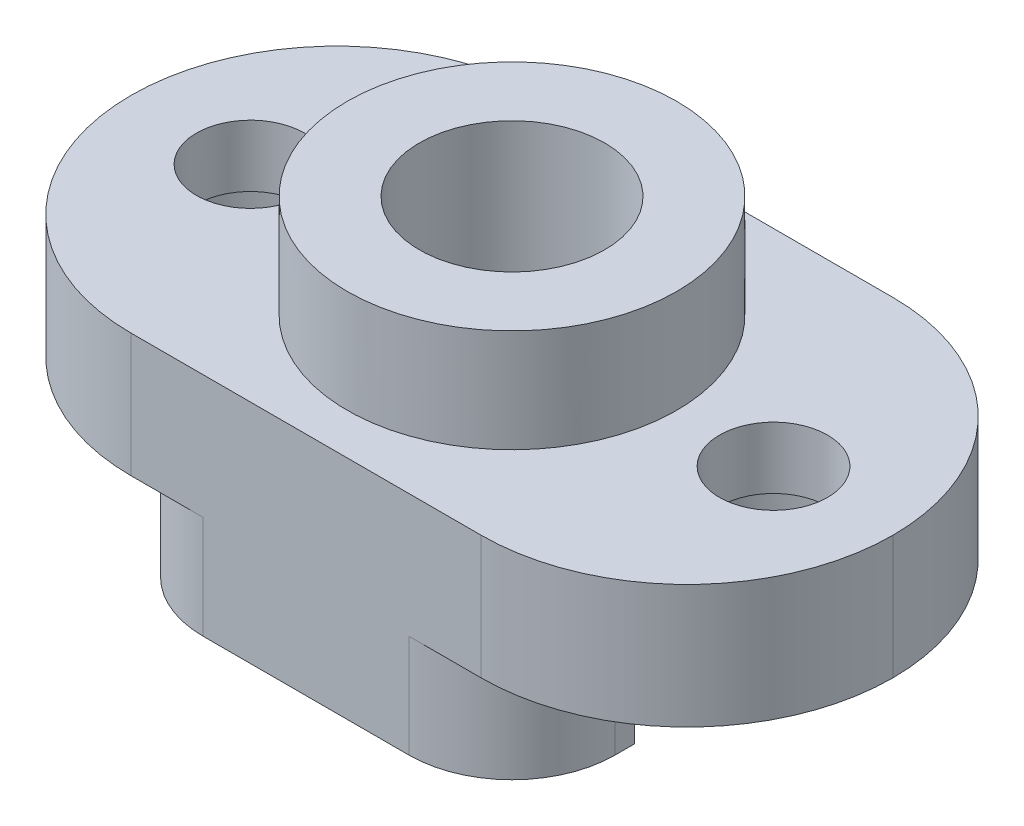
ISO-10303-21;
HEADER;
FILE_DESCRIPTION(('STEP AP214'),'2;1');
FILE_NAME('part.step','',(''),(''),'','','');
FILE_SCHEMA(('AUTOMOTIVE_DESIGN { 1 0 10303 214 1 1 1 1 }'));
ENDSEC;
DATA;
#1=APPLICATION_CONTEXT('core data for automotive mechanical design processes');
#2=APPLICATION_PROTOCOL_DEFINITION('international standard','automotive_design',2000,#1);
#3=PRODUCT_CONTEXT('',#1,'mechanical');
#4=PRODUCT('Part','Part','',(#3));
#5=PRODUCT_RELATED_PRODUCT_CATEGORY('part','',(#4));
#6=PRODUCT_DEFINITION_FORMATION('','',#4);
#7=PRODUCT_DEFINITION_CONTEXT('part definition',#1,'design');
#8=PRODUCT_DEFINITION('design','',#6,#7);
#9=PRODUCT_DEFINITION_SHAPE('','',#8);
#10=(LENGTH_UNIT() NAMED_UNIT(*) SI_UNIT(.MILLI.,.METRE.));
#11=(NAMED_UNIT(*) PLANE_ANGLE_UNIT() SI_UNIT($,.RADIAN.));
#12=(NAMED_UNIT(*) SI_UNIT($,.STERADIAN.) SOLID_ANGLE_UNIT());
#13=UNCERTAINTY_MEASURE_WITH_UNIT(LENGTH_MEASURE(1.E-05),#10,'distance_accuracy_value','');
#14=(GEOMETRIC_REPRESENTATION_CONTEXT(3) GLOBAL_UNCERTAINTY_ASSIGNED_CONTEXT((#13)) GLOBAL_UNIT_ASSIGNED_CONTEXT((#10,
#11,#12)) REPRESENTATION_CONTEXT('',''));
#15=CARTESIAN_POINT('',(0.,0.,0.));
#16=DIRECTION('',(0.,0.,1.));
#17=DIRECTION('',(1.,0.,0.));
#18=AXIS2_PLACEMENT_3D('',#15,#16,#17);
#19=CARTESIAN_POINT('',(-5.,-11.,5.));
#20=DIRECTION('',(0.,-1.,0.));
#21=DIRECTION('',(0.,0.,-1.));
#22=AXIS2_PLACEMENT_3D('',#19,#20,#21);
#23=PLANE('',#22);
#24=DIRECTION('',(0.866025403784439,0.,0.5));
#25=VECTOR('',#24,1.);
#26=CARTESIAN_POINT('',(0.,-11.,-8.08290376865476));
#27=LINE('',#26,#25);
#28=CARTESIAN_POINT('',(0.,-11.,-8.08290376865476));
#29=VERTEX_POINT('',#28);
#30=CARTESIAN_POINT('',(7.,-11.,-4.04145188432738));
#31=VERTEX_POINT('',#30);
#32=EDGE_CURVE('E203',#29,#31,#27,.T.);
#33=ORIENTED_EDGE('',*,*,#32,.F.);
#34=DIRECTION('',(0.866025403784439,0.,-0.5));
#35=VECTOR('',#34,1.);
#36=CARTESIAN_POINT('',(-7.,-11.,-4.04145188432738));
#37=LINE('',#36,#35);
#38=CARTESIAN_POINT('',(-7.,-11.,-4.04145188432738));
#39=VERTEX_POINT('',#38);
#40=EDGE_CURVE('E221',#39,#29,#37,.T.);
#41=ORIENTED_EDGE('',*,*,#40,.F.);
#42=DIRECTION('',(0.,0.,-1.));
#43=VECTOR('',#42,1.);
#44=CARTESIAN_POINT('',(-7.,-11.,4.04145188432738));
#45=LINE('',#44,#43);
#46=CARTESIAN_POINT('',(-7.,-11.,4.04145188432738));
#47=VERTEX_POINT('',#46);
#48=EDGE_CURVE('E224',#47,#39,#45,.T.);
#49=ORIENTED_EDGE('',*,*,#48,.F.);
#50=DIRECTION('',(-0.866025403784439,0.,-0.5));
#51=VECTOR('',#50,1.);
#52=CARTESIAN_POINT('',(0.,-11.,8.08290376865476));
#53=LINE('',#52,#51);
#54=CARTESIAN_POINT('',(0.,-11.,8.08290376865476));
#55=VERTEX_POINT('',#54);
#56=EDGE_CURVE('E244',#55,#47,#53,.T.);
#57=ORIENTED_EDGE('',*,*,#56,.F.);
#58=DIRECTION('',(-0.866025403784439,0.,0.5));
#59=VECTOR('',#58,1.);
#60=CARTESIAN_POINT('',(7.,-11.,4.04145188432738));
#61=LINE('',#60,#59);
#62=CARTESIAN_POINT('',(7.,-11.,4.04145188432738));
#63=VERTEX_POINT('',#62);
#64=EDGE_CURVE('E241',#63,#55,#61,.T.);
#65=ORIENTED_EDGE('',*,*,#64,.F.);
#66=DIRECTION('',(0.,0.,1.));
#67=VECTOR('',#66,1.);
#68=CARTESIAN_POINT('',(7.,-11.,-4.04145188432738));
#69=LINE('',#68,#67);
#70=EDGE_CURVE('E238',#31,#63,#69,.T.);
#71=ORIENTED_EDGE('',*,*,#70,.F.);
#72=EDGE_LOOP('',(#33,#41,#49,#57,#65,#71));
#73=FACE_BOUND('',#72,.T.);
#74=DIRECTION('',(0.,0.,1.));
#75=VECTOR('',#74,1.);
#76=CARTESIAN_POINT('',(-10.,-11.,5.));
#77=LINE('',#76,#75);
#78=CARTESIAN_POINT('',(-10.,-11.,4.05901773832044));
#79=VERTEX_POINT('',#78);
#80=CARTESIAN_POINT('',(-10.,-11.,5.));
#81=VERTEX_POINT('',#80);
#82=EDGE_CURVE('E341',#79,#81,#77,.T.);
#83=ORIENTED_EDGE('',*,*,#82,.F.);
#84=CARTESIAN_POINT('',(-12.7,-11.,0.));
#85=DIRECTION('',(0.,-1.,0.));
#86=DIRECTION('',(0.,0.,1.));
#87=AXIS2_PLACEMENT_3D('',#84,#85,#86);
#88=CIRCLE('',#87,4.875);
#89=CARTESIAN_POINT('',(-10.,-11.,-4.05901773832044));
#90=VERTEX_POINT('',#89);
#91=EDGE_CURVE('E269',#90,#79,#88,.T.);
#92=ORIENTED_EDGE('',*,*,#91,.F.);
#93=CARTESIAN_POINT('',(-10.,-11.,-5.));
#94=VERTEX_POINT('',#93);
#95=EDGE_CURVE('E342',#94,#90,#77,.T.);
#96=ORIENTED_EDGE('',*,*,#95,.F.);
#97=CARTESIAN_POINT('',(-5.,-11.,-5.));
#98=DIRECTION('',(0.,1.,0.));
#99=DIRECTION('',(0.,0.,-1.));
#100=AXIS2_PLACEMENT_3D('',#97,#98,#99);
#101=CIRCLE('',#100,5.);
#102=CARTESIAN_POINT('',(-5.,-11.,-10.));
#103=VERTEX_POINT('',#102);
#104=EDGE_CURVE('E338',#103,#94,#101,.T.);
#105=ORIENTED_EDGE('',*,*,#104,.F.);
#106=DIRECTION('',(-1.,0.,0.));
#107=VECTOR('',#106,1.);
#108=CARTESIAN_POINT('',(-5.,-11.,-10.));
#109=LINE('',#108,#107);
#110=CARTESIAN_POINT('',(5.,-11.,-10.));
#111=VERTEX_POINT('',#110);
#112=EDGE_CURVE('E335',#111,#103,#109,.T.);
#113=ORIENTED_EDGE('',*,*,#112,.F.);
#114=CARTESIAN_POINT('',(5.,-11.,-5.));
#115=DIRECTION('',(0.,1.,0.));
#116=DIRECTION('',(0.,0.,-1.));
#117=AXIS2_PLACEMENT_3D('',#114,#115,#116);
#118=CIRCLE('',#117,5.);
#119=CARTESIAN_POINT('',(10.,-11.,-5.));
#120=VERTEX_POINT('',#119);
#121=EDGE_CURVE('E332',#120,#111,#118,.T.);
#122=ORIENTED_EDGE('',*,*,#121,.F.);
#123=DIRECTION('',(0.,0.,-1.));
#124=VECTOR('',#123,1.);
#125=CARTESIAN_POINT('',(10.,-11.,5.));
#126=LINE('',#125,#124);
#127=CARTESIAN_POINT('',(10.,-11.,-4.05901773832045));
#128=VERTEX_POINT('',#127);
#129=EDGE_CURVE('E328',#128,#120,#126,.T.);
#130=ORIENTED_EDGE('',*,*,#129,.F.);
#131=CARTESIAN_POINT('',(12.7,-11.,0.));
#132=DIRECTION('',(0.,-1.,0.));
#133=DIRECTION('',(0.,0.,-1.));
#134=AXIS2_PLACEMENT_3D('',#131,#132,#133);
#135=CIRCLE('',#134,4.875);
#136=CARTESIAN_POINT('',(10.,-11.,4.05901773832045));
#137=VERTEX_POINT('',#136);
#138=EDGE_CURVE('E280',#137,#128,#135,.T.);
#139=ORIENTED_EDGE('',*,*,#138,.F.);
#140=CARTESIAN_POINT('',(10.,-11.,5.));
#141=VERTEX_POINT('',#140);
#142=EDGE_CURVE('E329',#141,#137,#126,.T.);
#143=ORIENTED_EDGE('',*,*,#142,.F.);
#144=CARTESIAN_POINT('',(5.,-11.,5.));
#145=DIRECTION('',(0.,1.,0.));
#146=DIRECTION('',(0.,0.,1.));
#147=AXIS2_PLACEMENT_3D('',#144,#145,#146);
#148=CIRCLE('',#147,5.);
#149=CARTESIAN_POINT('',(5.,-11.,10.));
#150=VERTEX_POINT('',#149);
#151=EDGE_CURVE('E325',#150,#141,#148,.T.);
#152=ORIENTED_EDGE('',*,*,#151,.F.);
#153=DIRECTION('',(1.,0.,0.));
#154=VECTOR('',#153,1.);
#155=CARTESIAN_POINT('',(-5.,-11.,10.));
#156=LINE('',#155,#154);
#157=CARTESIAN_POINT('',(-5.,-11.,10.));
#158=VERTEX_POINT('',#157);
#159=EDGE_CURVE('E321',#158,#150,#156,.T.);
#160=ORIENTED_EDGE('',*,*,#159,.F.);
#161=CARTESIAN_POINT('',(-5.,-11.,5.));
#162=DIRECTION('',(0.,1.,0.));
#163=DIRECTION('',(0.,0.,-1.));
#164=AXIS2_PLACEMENT_3D('',#161,#162,#163);
#165=CIRCLE('',#164,5.);
#166=EDGE_CURVE('E318',#81,#158,#165,.T.);
#167=ORIENTED_EDGE('',*,*,#166,.F.);
#168=EDGE_LOOP('',(#83,#92,#96,#105,#113,#122,#130,#139,#143,#152,#160,#167));
#169=FACE_BOUND('',#168,.T.);
#170=ADVANCED_FACE('F35',(#73,#169),#23,.T.);
#171=CARTESIAN_POINT('',(-10.,-11.,5.));
#172=DIRECTION('',(-1.,0.,0.));
#173=DIRECTION('',(0.,0.,1.));
#174=AXIS2_PLACEMENT_3D('',#171,#172,#173);
#175=PLANE('',#174);
#176=DIRECTION('',(0.,0.,-1.));
#177=VECTOR('',#176,1.);
#178=CARTESIAN_POINT('',(-10.,-6.,5.));
#179=LINE('',#178,#177);
#180=CARTESIAN_POINT('',(-10.,-6.,5.));
#181=VERTEX_POINT('',#180);
#182=CARTESIAN_POINT('',(-10.,-6.,4.05901773832044));
#183=VERTEX_POINT('',#182);
#184=EDGE_CURVE('E311',#181,#183,#179,.T.);
#185=ORIENTED_EDGE('',*,*,#184,.T.);
#186=DIRECTION('',(0.,1.,0.));
#187=VECTOR('',#186,1.);
#188=CARTESIAN_POINT('',(-10.,-11.,4.05901773832044));
#189=LINE('',#188,#187);
#190=EDGE_CURVE('E274',#183,#79,#189,.F.);
#191=ORIENTED_EDGE('',*,*,#190,.T.);
#192=ORIENTED_EDGE('',*,*,#82,.T.);
#193=DIRECTION('',(0.,1.,0.));
#194=VECTOR('',#193,1.);
#195=CARTESIAN_POINT('',(-10.,-11.,5.));
#196=LINE('',#195,#194);
#197=EDGE_CURVE('E350',#81,#181,#196,.T.);
#198=ORIENTED_EDGE('',*,*,#197,.T.);
#199=EDGE_LOOP('',(#185,#191,#192,#198));
#200=FACE_BOUND('',#199,.T.);
#201=ADVANCED_FACE('F472',(#200),#175,.T.);
#202=ORIENTED_EDGE('',*,*,#95,.T.);
#203=DIRECTION('',(0.,1.,0.));
#204=VECTOR('',#203,1.);
#205=CARTESIAN_POINT('',(-10.,-11.,-4.05901773832044));
#206=LINE('',#205,#204);
#207=CARTESIAN_POINT('',(-10.,-6.,-4.05901773832044));
#208=VERTEX_POINT('',#207);
#209=EDGE_CURVE('E271',#90,#208,#206,.T.);
#210=ORIENTED_EDGE('',*,*,#209,.T.);
#211=CARTESIAN_POINT('',(-10.,-6.,-5.));
#212=VERTEX_POINT('',#211);
#213=EDGE_CURVE('E310',#208,#212,#179,.T.);
#214=ORIENTED_EDGE('',*,*,#213,.T.);
#215=DIRECTION('',(0.,1.,0.));
#216=VECTOR('',#215,1.);
#217=CARTESIAN_POINT('',(-10.,-11.,-5.));
#218=LINE('',#217,#216);
#219=EDGE_CURVE('E354',#94,#212,#218,.T.);
#220=ORIENTED_EDGE('',*,*,#219,.F.);
#221=EDGE_LOOP('',(#202,#210,#214,#220));
#222=FACE_BOUND('',#221,.T.);
#223=ADVANCED_FACE('F479',(#222),#175,.T.);
#224=CARTESIAN_POINT('',(18.5,-6.,10.));
#225=DIRECTION('',(0.,1.,0.));
#226=DIRECTION('',(0.,0.,1.));
#227=AXIS2_PLACEMENT_3D('',#224,#225,#226);
#228=PLANE('',#227);
#229=DIRECTION('',(1.,0.,0.));
#230=VECTOR('',#229,1.);
#231=CARTESIAN_POINT('',(-18.5,-6.,10.));
#232=LINE('',#231,#230);
#233=CARTESIAN_POINT('',(-8.49999999999999,-6.,10.));
#234=VERTEX_POINT('',#233);
#235=CARTESIAN_POINT('',(-5.,-6.,10.));
#236=VERTEX_POINT('',#235);
#237=EDGE_CURVE('E295',#234,#236,#232,.T.);
#238=ORIENTED_EDGE('',*,*,#237,.F.);
#239=CARTESIAN_POINT('',(-8.49999999999999,-6.,0.));
#240=DIRECTION('',(0.,1.,0.));
#241=DIRECTION('',(0.,0.,1.));
#242=AXIS2_PLACEMENT_3D('',#239,#240,#241);
#243=CIRCLE('',#242,10.);
#244=CARTESIAN_POINT('',(-18.5,-6.,0.));
#245=VERTEX_POINT('',#244);
#246=EDGE_CURVE('E399',#234,#245,#243,.F.);
#247=ORIENTED_EDGE('',*,*,#246,.T.);
#248=CARTESIAN_POINT('',(-8.49999999999999,-6.,0.));
#249=DIRECTION('',(0.,1.,0.));
#250=DIRECTION('',(0.,0.,1.));
#251=AXIS2_PLACEMENT_3D('',#248,#249,#250);
#252=CIRCLE('',#251,10.);
#253=CARTESIAN_POINT('',(-8.49999999999999,-6.,-10.));
#254=VERTEX_POINT('',#253);
#255=EDGE_CURVE('E397',#245,#254,#252,.F.);
#256=ORIENTED_EDGE('',*,*,#255,.T.);
#257=DIRECTION('',(-1.,0.,0.));
#258=VECTOR('',#257,1.);
#259=CARTESIAN_POINT('',(-18.5,-6.,-10.));
#260=LINE('',#259,#258);
#261=CARTESIAN_POINT('',(-5.,-6.,-10.));
#262=VERTEX_POINT('',#261);
#263=EDGE_CURVE('E291',#262,#254,#260,.T.);
#264=ORIENTED_EDGE('',*,*,#263,.F.);
#265=CARTESIAN_POINT('',(-5.,-6.,-5.));
#266=DIRECTION('',(0.,1.,0.));
#267=DIRECTION('',(0.,0.,1.));
#268=AXIS2_PLACEMENT_3D('',#265,#266,#267);
#269=CIRCLE('',#268,5.);
#270=EDGE_CURVE('E307',#212,#262,#269,.F.);
#271=ORIENTED_EDGE('',*,*,#270,.F.);
#272=ORIENTED_EDGE('',*,*,#213,.F.);
#273=CARTESIAN_POINT('',(-12.7,-6.,0.));
#274=DIRECTION('',(0.,1.,0.));
#275=DIRECTION('',(0.,0.,1.));
#276=AXIS2_PLACEMENT_3D('',#273,#274,#275);
#277=CIRCLE('',#276,4.875);
#278=EDGE_CURVE('E378',#183,#208,#277,.F.);
#279=ORIENTED_EDGE('',*,*,#278,.F.);
#280=ORIENTED_EDGE('',*,*,#184,.F.);
#281=CARTESIAN_POINT('',(-5.,-6.,5.));
#282=DIRECTION('',(0.,1.,0.));
#283=DIRECTION('',(0.,0.,1.));
#284=AXIS2_PLACEMENT_3D('',#281,#282,#283);
#285=CIRCLE('',#284,5.);
#286=EDGE_CURVE('E314',#236,#181,#285,.F.);
#287=ORIENTED_EDGE('',*,*,#286,.F.);
#288=EDGE_LOOP('',(#238,#247,#256,#264,#271,#272,#279,#280,#287));
#289=FACE_BOUND('',#288,.T.);
#290=ADVANCED_FACE('F465',(#289),#228,.F.);
#291=CARTESIAN_POINT('',(10.,-11.,5.));
#292=DIRECTION('',(1.,0.,0.));
#293=DIRECTION('',(0.,0.,-1.));
#294=AXIS2_PLACEMENT_3D('',#291,#292,#293);
#295=PLANE('',#294);
#296=DIRECTION('',(0.,0.,1.));
#297=VECTOR('',#296,1.);
#298=CARTESIAN_POINT('',(10.,-6.,5.));
#299=LINE('',#298,#297);
#300=CARTESIAN_POINT('',(10.,-6.,-5.));
#301=VERTEX_POINT('',#300);
#302=CARTESIAN_POINT('',(10.,-6.,-4.05901773832045));
#303=VERTEX_POINT('',#302);
#304=EDGE_CURVE('E301',#301,#303,#299,.T.);
#305=ORIENTED_EDGE('',*,*,#304,.T.);
#306=DIRECTION('',(0.,1.,0.));
#307=VECTOR('',#306,1.);
#308=CARTESIAN_POINT('',(10.,-11.,-4.05901773832045));
#309=LINE('',#308,#307);
#310=EDGE_CURVE('E285',#303,#128,#309,.F.);
#311=ORIENTED_EDGE('',*,*,#310,.T.);
#312=ORIENTED_EDGE('',*,*,#129,.T.);
#313=DIRECTION('',(0.,1.,0.));
#314=VECTOR('',#313,1.);
#315=CARTESIAN_POINT('',(10.,-11.,-5.));
#316=LINE('',#315,#314);
#317=EDGE_CURVE('E363',#120,#301,#316,.T.);
#318=ORIENTED_EDGE('',*,*,#317,.T.);
#319=EDGE_LOOP('',(#305,#311,#312,#318));
#320=FACE_BOUND('',#319,.T.);
#321=ADVANCED_FACE('F440',(#320),#295,.T.);
#322=ORIENTED_EDGE('',*,*,#142,.T.);
#323=DIRECTION('',(0.,1.,0.));
#324=VECTOR('',#323,1.);
#325=CARTESIAN_POINT('',(10.,-11.,4.05901773832045));
#326=LINE('',#325,#324);
#327=CARTESIAN_POINT('',(10.,-6.,4.05901773832045));
#328=VERTEX_POINT('',#327);
#329=EDGE_CURVE('E282',#137,#328,#326,.T.);
#330=ORIENTED_EDGE('',*,*,#329,.T.);
#331=CARTESIAN_POINT('',(10.,-6.,5.));
#332=VERTEX_POINT('',#331);
#333=EDGE_CURVE('E300',#328,#332,#299,.T.);
#334=ORIENTED_EDGE('',*,*,#333,.T.);
#335=DIRECTION('',(0.,1.,0.));
#336=VECTOR('',#335,1.);
#337=CARTESIAN_POINT('',(10.,-11.,5.));
#338=LINE('',#337,#336);
#339=EDGE_CURVE('E366',#141,#332,#338,.T.);
#340=ORIENTED_EDGE('',*,*,#339,.F.);
#341=EDGE_LOOP('',(#322,#330,#334,#340));
#342=FACE_BOUND('',#341,.T.);
#343=ADVANCED_FACE('F434',(#342),#295,.T.);
#344=CARTESIAN_POINT('',(8.5,-6.,-10.));
#345=VERTEX_POINT('',#344);
#346=CARTESIAN_POINT('',(5.,-6.,-10.));
#347=VERTEX_POINT('',#346);
#348=EDGE_CURVE('E292',#345,#347,#260,.T.);
#349=ORIENTED_EDGE('',*,*,#348,.F.);
#350=CARTESIAN_POINT('',(8.5,-6.,0.));
#351=DIRECTION('',(0.,1.,0.));
#352=DIRECTION('',(0.,0.,1.));
#353=AXIS2_PLACEMENT_3D('',#350,#351,#352);
#354=CIRCLE('',#353,10.);
#355=CARTESIAN_POINT('',(18.5,-6.,0.));
#356=VERTEX_POINT('',#355);
#357=EDGE_CURVE('E11',#345,#356,#354,.F.);
#358=ORIENTED_EDGE('',*,*,#357,.T.);
#359=CARTESIAN_POINT('',(8.5,-6.,0.));
#360=DIRECTION('',(0.,1.,0.));
#361=DIRECTION('',(0.,0.,1.));
#362=AXIS2_PLACEMENT_3D('',#359,#360,#361);
#363=CIRCLE('',#362,10.);
#364=CARTESIAN_POINT('',(8.5,-6.,10.));
#365=VERTEX_POINT('',#364);
#366=EDGE_CURVE('E44',#356,#365,#363,.F.);
#367=ORIENTED_EDGE('',*,*,#366,.T.);
#368=CARTESIAN_POINT('',(5.,-6.,10.));
#369=VERTEX_POINT('',#368);
#370=EDGE_CURVE('E294',#369,#365,#232,.T.);
#371=ORIENTED_EDGE('',*,*,#370,.F.);
#372=CARTESIAN_POINT('',(5.,-6.,5.));
#373=DIRECTION('',(0.,1.,0.));
#374=DIRECTION('',(0.,0.,1.));
#375=AXIS2_PLACEMENT_3D('',#372,#373,#374);
#376=CIRCLE('',#375,5.);
#377=EDGE_CURVE('E297',#332,#369,#376,.F.);
#378=ORIENTED_EDGE('',*,*,#377,.F.);
#379=ORIENTED_EDGE('',*,*,#333,.F.);
#380=CARTESIAN_POINT('',(12.7,-6.,0.));
#381=DIRECTION('',(0.,1.,0.));
#382=DIRECTION('',(0.,0.,1.));
#383=AXIS2_PLACEMENT_3D('',#380,#381,#382);
#384=CIRCLE('',#383,4.875);
#385=EDGE_CURVE('E376',#303,#328,#384,.F.);
#386=ORIENTED_EDGE('',*,*,#385,.F.);
#387=ORIENTED_EDGE('',*,*,#304,.F.);
#388=CARTESIAN_POINT('',(5.,-6.,-5.));
#389=DIRECTION('',(0.,1.,0.));
#390=DIRECTION('',(0.,0.,1.));
#391=AXIS2_PLACEMENT_3D('',#388,#389,#390);
#392=CIRCLE('',#391,5.);
#393=EDGE_CURVE('E304',#347,#301,#392,.F.);
#394=ORIENTED_EDGE('',*,*,#393,.F.);
#395=EDGE_LOOP('',(#349,#358,#367,#371,#378,#379,#386,#387,#394));
#396=FACE_BOUND('',#395,.T.);
#397=ADVANCED_FACE('F418',(#396),#228,.F.);
#398=CARTESIAN_POINT('',(-5.,0.,5.));
#399=DIRECTION('',(0.,-1.,0.));
#400=DIRECTION('',(0.,0.,-1.));
#401=AXIS2_PLACEMENT_3D('',#398,#399,#400);
#402=PLANE('',#401);
#403=CARTESIAN_POINT('',(-12.7,0.,0.));
#404=DIRECTION('',(0.,-1.,0.));
#405=DIRECTION('',(0.,0.,-1.));
#406=AXIS2_PLACEMENT_3D('',#403,#404,#405);
#407=CIRCLE('',#406,2.625);
#408=CARTESIAN_POINT('',(-12.7,0.,-2.625));
#409=VERTEX_POINT('',#408);
#410=EDGE_CURVE('E259',#409,#409,#407,.T.);
#411=ORIENTED_EDGE('',*,*,#410,.T.);
#412=EDGE_LOOP('',(#411));
#413=FACE_BOUND('',#412,.T.);
#414=CARTESIAN_POINT('',(12.7,0.,0.));
#415=DIRECTION('',(0.,-1.,0.));
#416=DIRECTION('',(0.,0.,-1.));
#417=AXIS2_PLACEMENT_3D('',#414,#415,#416);
#418=CIRCLE('',#417,2.625);
#419=CARTESIAN_POINT('',(12.7,0.,-2.625));
#420=VERTEX_POINT('',#419);
#421=EDGE_CURVE('E263',#420,#420,#418,.T.);
#422=ORIENTED_EDGE('',*,*,#421,.T.);
#423=EDGE_LOOP('',(#422));
#424=FACE_BOUND('',#423,.T.);
#425=CARTESIAN_POINT('',(-8.49999999999999,0.,0.));
#426=DIRECTION('',(0.,-1.,0.));
#427=DIRECTION('',(0.,0.,-1.));
#428=AXIS2_PLACEMENT_3D('',#425,#426,#427);
#429=CIRCLE('',#428,10.);
#430=CARTESIAN_POINT('',(-8.49999999999999,0.,-10.));
#431=VERTEX_POINT('',#430);
#432=CARTESIAN_POINT('',(-18.5,0.,0.));
#433=VERTEX_POINT('',#432);
#434=EDGE_CURVE('E388',#431,#433,#429,.F.);
#435=ORIENTED_EDGE('',*,*,#434,.T.);
#436=CARTESIAN_POINT('',(-8.49999999999999,0.,0.));
#437=DIRECTION('',(0.,-1.,0.));
#438=DIRECTION('',(0.,0.,-1.));
#439=AXIS2_PLACEMENT_3D('',#436,#437,#438);
#440=CIRCLE('',#439,10.);
#441=CARTESIAN_POINT('',(-8.49999999999999,0.,10.));
#442=VERTEX_POINT('',#441);
#443=EDGE_CURVE('E390',#433,#442,#440,.F.);
#444=ORIENTED_EDGE('',*,*,#443,.T.);
#445=DIRECTION('',(1.,0.,0.));
#446=VECTOR('',#445,1.);
#447=CARTESIAN_POINT('',(-5.,0.,10.));
#448=LINE('',#447,#446);
#449=CARTESIAN_POINT('',(8.5,0.,10.));
#450=VERTEX_POINT('',#449);
#451=EDGE_CURVE('E317',#442,#450,#448,.T.);
#452=ORIENTED_EDGE('',*,*,#451,.T.);
#453=CARTESIAN_POINT('',(8.5,0.,0.));
#454=DIRECTION('',(0.,-1.,0.));
#455=DIRECTION('',(0.,0.,-1.));
#456=AXIS2_PLACEMENT_3D('',#453,#454,#455);
#457=CIRCLE('',#456,10.);
#458=CARTESIAN_POINT('',(18.5,0.,0.));
#459=VERTEX_POINT('',#458);
#460=EDGE_CURVE('E380',#450,#459,#457,.F.);
#461=ORIENTED_EDGE('',*,*,#460,.T.);
#462=CARTESIAN_POINT('',(8.5,0.,0.));
#463=DIRECTION('',(0.,-1.,0.));
#464=DIRECTION('',(0.,0.,-1.));
#465=AXIS2_PLACEMENT_3D('',#462,#463,#464);
#466=CIRCLE('',#465,10.);
#467=CARTESIAN_POINT('',(8.5,0.,-10.));
#468=VERTEX_POINT('',#467);
#469=EDGE_CURVE('E386',#459,#468,#466,.F.);
#470=ORIENTED_EDGE('',*,*,#469,.T.);
#471=DIRECTION('',(-1.,0.,0.));
#472=VECTOR('',#471,1.);
#473=CARTESIAN_POINT('',(-5.,0.,-10.));
#474=LINE('',#473,#472);
#475=EDGE_CURVE('E322',#468,#431,#474,.T.);
#476=ORIENTED_EDGE('',*,*,#475,.T.);
#477=EDGE_LOOP('',(#435,#444,#452,#461,#470,#476));
#478=FACE_BOUND('',#477,.T.);
#479=CARTESIAN_POINT('',(0.,0.,0.));
#480=DIRECTION('',(0.,-1.,0.));
#481=DIRECTION('',(0.,0.,-1.));
#482=AXIS2_PLACEMENT_3D('',#479,#480,#481);
#483=CIRCLE('',#482,8.);
#484=CARTESIAN_POINT('',(0.,0.,-8.));
#485=VERTEX_POINT('',#484);
#486=EDGE_CURVE('E353',#485,#485,#483,.F.);
#487=ORIENTED_EDGE('',*,*,#486,.F.);
#488=EDGE_LOOP('',(#487));
#489=FACE_BOUND('',#488,.T.);
#490=ADVANCED_FACE('F455',(#413,#424,#478,#489),#402,.F.);
#491=CARTESIAN_POINT('',(-5.,-11.,5.));
#492=DIRECTION('',(0.,1.,0.));
#493=DIRECTION('',(0.,0.,1.));
#494=AXIS2_PLACEMENT_3D('',#491,#492,#493);
#495=CYLINDRICAL_SURFACE('',#494,5.);
#496=DIRECTION('',(0.,1.,0.));
#497=VECTOR('',#496,1.);
#498=CARTESIAN_POINT('',(-5.,-11.,10.));
#499=LINE('',#498,#497);
#500=EDGE_CURVE('E345',#158,#236,#499,.T.);
#501=ORIENTED_EDGE('',*,*,#500,.T.);
#502=ORIENTED_EDGE('',*,*,#286,.T.);
#503=ORIENTED_EDGE('',*,*,#197,.F.);
#504=ORIENTED_EDGE('',*,*,#166,.T.);
#505=EDGE_LOOP('',(#501,#502,#503,#504));
#506=FACE_BOUND('',#505,.T.);
#507=ADVANCED_FACE('F469',(#506),#495,.T.);
#508=CARTESIAN_POINT('',(-5.,-11.,-5.));
#509=DIRECTION('',(0.,1.,0.));
#510=DIRECTION('',(0.,0.,1.));
#511=AXIS2_PLACEMENT_3D('',#508,#509,#510);
#512=CYLINDRICAL_SURFACE('',#511,5.);
#513=ORIENTED_EDGE('',*,*,#219,.T.);
#514=ORIENTED_EDGE('',*,*,#270,.T.);
#515=DIRECTION('',(0.,1.,0.));
#516=VECTOR('',#515,1.);
#517=CARTESIAN_POINT('',(-5.,-11.,-10.));
#518=LINE('',#517,#516);
#519=EDGE_CURVE('E357',#103,#262,#518,.T.);
#520=ORIENTED_EDGE('',*,*,#519,.F.);
#521=ORIENTED_EDGE('',*,*,#104,.T.);
#522=EDGE_LOOP('',(#513,#514,#520,#521));
#523=FACE_BOUND('',#522,.T.);
#524=ADVANCED_FACE('F481',(#523),#512,.T.);
#525=CARTESIAN_POINT('',(5.,-11.,-5.));
#526=DIRECTION('',(0.,1.,0.));
#527=DIRECTION('',(0.,0.,1.));
#528=AXIS2_PLACEMENT_3D('',#525,#526,#527);
#529=CYLINDRICAL_SURFACE('',#528,5.);
#530=DIRECTION('',(0.,1.,0.));
#531=VECTOR('',#530,1.);
#532=CARTESIAN_POINT('',(5.,-11.,-10.));
#533=LINE('',#532,#531);
#534=EDGE_CURVE('E360',#111,#347,#533,.T.);
#535=ORIENTED_EDGE('',*,*,#534,.T.);
#536=ORIENTED_EDGE('',*,*,#393,.T.);
#537=ORIENTED_EDGE('',*,*,#317,.F.);
#538=ORIENTED_EDGE('',*,*,#121,.T.);
#539=EDGE_LOOP('',(#535,#536,#537,#538));
#540=FACE_BOUND('',#539,.T.);
#541=ADVANCED_FACE('F444',(#540),#529,.T.);
#542=CARTESIAN_POINT('',(5.,-11.,5.));
#543=DIRECTION('',(0.,1.,0.));
#544=DIRECTION('',(0.,0.,1.));
#545=AXIS2_PLACEMENT_3D('',#542,#543,#544);
#546=CYLINDRICAL_SURFACE('',#545,5.);
#547=ORIENTED_EDGE('',*,*,#339,.T.);
#548=ORIENTED_EDGE('',*,*,#377,.T.);
#549=DIRECTION('',(0.,1.,0.));
#550=VECTOR('',#549,1.);
#551=CARTESIAN_POINT('',(5.,-11.,10.));
#552=LINE('',#551,#550);
#553=EDGE_CURVE('E369',#150,#369,#552,.T.);
#554=ORIENTED_EDGE('',*,*,#553,.F.);
#555=ORIENTED_EDGE('',*,*,#151,.T.);
#556=EDGE_LOOP('',(#547,#548,#554,#555));
#557=FACE_BOUND('',#556,.T.);
#558=ADVANCED_FACE('F426',(#557),#546,.T.);
#559=CARTESIAN_POINT('',(-5.,-11.,-10.));
#560=DIRECTION('',(0.,0.,-1.));
#561=DIRECTION('',(-1.,0.,0.));
#562=AXIS2_PLACEMENT_3D('',#559,#560,#561);
#563=PLANE('',#562);
#564=ORIENTED_EDGE('',*,*,#263,.T.);
#565=DIRECTION('',(0.,1.,0.));
#566=VECTOR('',#565,1.);
#567=CARTESIAN_POINT('',(-8.49999999999999,-11.,-10.));
#568=LINE('',#567,#566);
#569=EDGE_CURVE('E403',#254,#431,#568,.T.);
#570=ORIENTED_EDGE('',*,*,#569,.T.);
#571=ORIENTED_EDGE('',*,*,#475,.F.);
#572=DIRECTION('',(0.,1.,0.));
#573=VECTOR('',#572,1.);
#574=CARTESIAN_POINT('',(8.5,-11.,-10.));
#575=LINE('',#574,#573);
#576=EDGE_CURVE('E401',#468,#345,#575,.F.);
#577=ORIENTED_EDGE('',*,*,#576,.T.);
#578=ORIENTED_EDGE('',*,*,#348,.T.);
#579=ORIENTED_EDGE('',*,*,#534,.F.);
#580=ORIENTED_EDGE('',*,*,#112,.T.);
#581=ORIENTED_EDGE('',*,*,#519,.T.);
#582=EDGE_LOOP('',(#564,#570,#571,#577,#578,#579,#580,#581));
#583=FACE_BOUND('',#582,.T.);
#584=ADVANCED_FACE('F450',(#583),#563,.T.);
#585=CARTESIAN_POINT('',(-5.,-11.,10.));
#586=DIRECTION('',(0.,0.,1.));
#587=DIRECTION('',(1.,0.,0.));
#588=AXIS2_PLACEMENT_3D('',#585,#586,#587);
#589=PLANE('',#588);
#590=ORIENTED_EDGE('',*,*,#451,.F.);
#591=DIRECTION('',(0.,1.,0.));
#592=VECTOR('',#591,1.);
#593=CARTESIAN_POINT('',(-8.49999999999999,-11.,10.));
#594=LINE('',#593,#592);
#595=EDGE_CURVE('E394',#442,#234,#594,.F.);
#596=ORIENTED_EDGE('',*,*,#595,.T.);
#597=ORIENTED_EDGE('',*,*,#237,.T.);
#598=ORIENTED_EDGE('',*,*,#500,.F.);
#599=ORIENTED_EDGE('',*,*,#159,.T.);
#600=ORIENTED_EDGE('',*,*,#553,.T.);
#601=ORIENTED_EDGE('',*,*,#370,.T.);
#602=DIRECTION('',(0.,1.,0.));
#603=VECTOR('',#602,1.);
#604=CARTESIAN_POINT('',(8.5,-11.,10.));
#605=LINE('',#604,#603);
#606=EDGE_CURVE('E392',#365,#450,#605,.T.);
#607=ORIENTED_EDGE('',*,*,#606,.T.);
#608=EDGE_LOOP('',(#590,#596,#597,#598,#599,#600,#601,#607));
#609=FACE_BOUND('',#608,.T.);
#610=ADVANCED_FACE('F422',(#609),#589,.T.);
#611=CARTESIAN_POINT('',(0.,5.,0.));
#612=DIRECTION('',(0.,-1.,0.));
#613=DIRECTION('',(0.,0.,-1.));
#614=AXIS2_PLACEMENT_3D('',#611,#612,#613);
#615=CYLINDRICAL_SURFACE('',#614,8.);
#616=CARTESIAN_POINT('',(0.,5.,0.));
#617=DIRECTION('',(0.,1.,0.));
#618=DIRECTION('',(0.,0.,1.));
#619=AXIS2_PLACEMENT_3D('',#616,#617,#618);
#620=CIRCLE('',#619,8.);
#621=CARTESIAN_POINT('',(0.,5.,8.));
#622=VERTEX_POINT('',#621);
#623=EDGE_CURVE('E288',#622,#622,#620,.T.);
#624=ORIENTED_EDGE('',*,*,#623,.F.);
#625=EDGE_LOOP('',(#624));
#626=FACE_BOUND('',#625,.T.);
#627=ORIENTED_EDGE('',*,*,#486,.T.);
#628=EDGE_LOOP('',(#627));
#629=FACE_BOUND('',#628,.T.);
#630=ADVANCED_FACE('F537',(#626,#629),#615,.T.);
#631=CARTESIAN_POINT('',(0.,5.,0.));
#632=DIRECTION('',(0.,1.,0.));
#633=DIRECTION('',(0.,0.,1.));
#634=AXIS2_PLACEMENT_3D('',#631,#632,#633);
#635=PLANE('',#634);
#636=CARTESIAN_POINT('',(0.,5.,0.));
#637=DIRECTION('',(0.,-1.,0.));
#638=DIRECTION('',(0.,0.,-1.));
#639=AXIS2_PLACEMENT_3D('',#636,#637,#638);
#640=CIRCLE('',#639,4.5);
#641=CARTESIAN_POINT('',(0.,5.,-4.5));
#642=VERTEX_POINT('',#641);
#643=EDGE_CURVE('E239',#642,#642,#640,.T.);
#644=ORIENTED_EDGE('',*,*,#643,.T.);
#645=EDGE_LOOP('',(#644));
#646=FACE_BOUND('',#645,.T.);
#647=ORIENTED_EDGE('',*,*,#623,.T.);
#648=EDGE_LOOP('',(#647));
#649=FACE_BOUND('',#648,.T.);
#650=ADVANCED_FACE('F535',(#646,#649),#635,.T.);
#651=CARTESIAN_POINT('',(12.7,-11.,0.));
#652=DIRECTION('',(0.,1.,0.));
#653=DIRECTION('',(0.,0.,1.));
#654=AXIS2_PLACEMENT_3D('',#651,#652,#653);
#655=CYLINDRICAL_SURFACE('',#654,4.875);
#656=ORIENTED_EDGE('',*,*,#385,.T.);
#657=ORIENTED_EDGE('',*,*,#329,.F.);
#658=ORIENTED_EDGE('',*,*,#138,.T.);
#659=ORIENTED_EDGE('',*,*,#310,.F.);
#660=EDGE_LOOP('',(#656,#657,#658,#659));
#661=FACE_BOUND('',#660,.T.);
#662=CARTESIAN_POINT('',(12.7,-3.,0.));
#663=DIRECTION('',(0.,-1.,0.));
#664=DIRECTION('',(0.,0.,-1.));
#665=AXIS2_PLACEMENT_3D('',#662,#663,#664);
#666=CIRCLE('',#665,4.875);
#667=CARTESIAN_POINT('',(12.7,-3.,-4.875));
#668=VERTEX_POINT('',#667);
#669=EDGE_CURVE('E277',#668,#668,#666,.T.);
#670=ORIENTED_EDGE('',*,*,#669,.F.);
#671=EDGE_LOOP('',(#670));
#672=FACE_BOUND('',#671,.T.);
#673=ADVANCED_FACE('F531',(#661,#672),#655,.F.);
#674=CARTESIAN_POINT('',(12.7,-3.,0.));
#675=DIRECTION('',(0.,-1.,0.));
#676=DIRECTION('',(0.,0.,-1.));
#677=AXIS2_PLACEMENT_3D('',#674,#675,#676);
#678=PLANE('',#677);
#679=CARTESIAN_POINT('',(12.7,-3.,0.));
#680=DIRECTION('',(0.,-1.,0.));
#681=DIRECTION('',(0.,0.,-1.));
#682=AXIS2_PLACEMENT_3D('',#679,#680,#681);
#683=CIRCLE('',#682,2.625);
#684=CARTESIAN_POINT('',(12.7,-3.,-2.625));
#685=VERTEX_POINT('',#684);
#686=EDGE_CURVE('E262',#685,#685,#683,.T.);
#687=ORIENTED_EDGE('',*,*,#686,.F.);
#688=EDGE_LOOP('',(#687));
#689=FACE_BOUND('',#688,.T.);
#690=ORIENTED_EDGE('',*,*,#669,.T.);
#691=EDGE_LOOP('',(#690));
#692=FACE_BOUND('',#691,.T.);
#693=ADVANCED_FACE('F528',(#689,#692),#678,.T.);
#694=CARTESIAN_POINT('',(-12.7,-11.,0.));
#695=DIRECTION('',(0.,1.,0.));
#696=DIRECTION('',(0.,0.,1.));
#697=AXIS2_PLACEMENT_3D('',#694,#695,#696);
#698=CYLINDRICAL_SURFACE('',#697,4.875);
#699=ORIENTED_EDGE('',*,*,#278,.T.);
#700=ORIENTED_EDGE('',*,*,#209,.F.);
#701=ORIENTED_EDGE('',*,*,#91,.T.);
#702=ORIENTED_EDGE('',*,*,#190,.F.);
#703=EDGE_LOOP('',(#699,#700,#701,#702));
#704=FACE_BOUND('',#703,.T.);
#705=CARTESIAN_POINT('',(-12.7,-3.,0.));
#706=DIRECTION('',(0.,-1.,0.));
#707=DIRECTION('',(0.,0.,1.));
#708=AXIS2_PLACEMENT_3D('',#705,#706,#707);
#709=CIRCLE('',#708,4.875);
#710=CARTESIAN_POINT('',(-12.7,-3.,4.875));
#711=VERTEX_POINT('',#710);
#712=EDGE_CURVE('E266',#711,#711,#709,.T.);
#713=ORIENTED_EDGE('',*,*,#712,.F.);
#714=EDGE_LOOP('',(#713));
#715=FACE_BOUND('',#714,.T.);
#716=ADVANCED_FACE('F474',(#704,#715),#698,.F.);
#717=CARTESIAN_POINT('',(-12.7,-3.,0.));
#718=DIRECTION('',(0.,1.,0.));
#719=DIRECTION('',(0.,0.,1.));
#720=AXIS2_PLACEMENT_3D('',#717,#718,#719);
#721=PLANE('',#720);
#722=CARTESIAN_POINT('',(-12.7,-3.,0.));
#723=DIRECTION('',(0.,1.,0.));
#724=DIRECTION('',(0.,0.,1.));
#725=AXIS2_PLACEMENT_3D('',#722,#723,#724);
#726=CIRCLE('',#725,2.625);
#727=CARTESIAN_POINT('',(-12.7,-3.,2.625));
#728=VERTEX_POINT('',#727);
#729=EDGE_CURVE('E251',#728,#728,#726,.T.);
#730=ORIENTED_EDGE('',*,*,#729,.T.);
#731=EDGE_LOOP('',(#730));
#732=FACE_BOUND('',#731,.T.);
#733=ORIENTED_EDGE('',*,*,#712,.T.);
#734=EDGE_LOOP('',(#733));
#735=FACE_BOUND('',#734,.T.);
#736=ADVANCED_FACE('F513',(#732,#735),#721,.F.);
#737=CARTESIAN_POINT('',(12.7,5.,0.));
#738=DIRECTION('',(0.,-1.,0.));
#739=DIRECTION('',(0.,0.,-1.));
#740=AXIS2_PLACEMENT_3D('',#737,#738,#739);
#741=CYLINDRICAL_SURFACE('',#740,2.625);
#742=ORIENTED_EDGE('',*,*,#686,.T.);
#743=EDGE_LOOP('',(#742));
#744=FACE_BOUND('',#743,.T.);
#745=ORIENTED_EDGE('',*,*,#421,.F.);
#746=EDGE_LOOP('',(#745));
#747=FACE_BOUND('',#746,.T.);
#748=ADVANCED_FACE('F510',(#744,#747),#741,.F.);
#749=CARTESIAN_POINT('',(-12.7,5.,0.));
#750=DIRECTION('',(0.,-1.,0.));
#751=DIRECTION('',(0.,0.,-1.));
#752=AXIS2_PLACEMENT_3D('',#749,#750,#751);
#753=CYLINDRICAL_SURFACE('',#752,2.625);
#754=ORIENTED_EDGE('',*,*,#729,.F.);
#755=EDGE_LOOP('',(#754));
#756=FACE_BOUND('',#755,.T.);
#757=ORIENTED_EDGE('',*,*,#410,.F.);
#758=EDGE_LOOP('',(#757));
#759=FACE_BOUND('',#758,.T.);
#760=ADVANCED_FACE('F512',(#756,#759),#753,.F.);
#761=CARTESIAN_POINT('',(0.,-5.,-8.08290376865476));
#762=DIRECTION('',(0.5,0.,-0.866025403784439));
#763=DIRECTION('',(-0.866025403784439,0.,-0.5));
#764=AXIS2_PLACEMENT_3D('',#761,#762,#763);
#765=PLANE('',#764);
#766=ORIENTED_EDGE('',*,*,#32,.T.);
#767=DIRECTION('',(0.,-1.,0.));
#768=VECTOR('',#767,1.);
#769=CARTESIAN_POINT('',(7.,-5.,-4.04145188432738));
#770=LINE('',#769,#768);
#771=CARTESIAN_POINT('',(7.,-5.,-4.04145188432738));
#772=VERTEX_POINT('',#771);
#773=EDGE_CURVE('E196',#772,#31,#770,.T.);
#774=ORIENTED_EDGE('',*,*,#773,.F.);
#775=DIRECTION('',(0.866025403784439,0.,0.5));
#776=VECTOR('',#775,1.);
#777=CARTESIAN_POINT('',(0.,-5.,-8.08290376865476));
#778=LINE('',#777,#776);
#779=CARTESIAN_POINT('',(0.,-5.,-8.08290376865476));
#780=VERTEX_POINT('',#779);
#781=EDGE_CURVE('E200',#780,#772,#778,.T.);
#782=ORIENTED_EDGE('',*,*,#781,.F.);
#783=DIRECTION('',(0.,-1.,0.));
#784=VECTOR('',#783,1.);
#785=CARTESIAN_POINT('',(0.,-5.,-8.08290376865476));
#786=LINE('',#785,#784);
#787=EDGE_CURVE('E249',#780,#29,#786,.T.);
#788=ORIENTED_EDGE('',*,*,#787,.T.);
#789=EDGE_LOOP('',(#766,#774,#782,#788));
#790=FACE_BOUND('',#789,.T.);
#791=ADVANCED_FACE('F198',(#790),#765,.F.);
#792=CARTESIAN_POINT('',(-7.,-5.,-4.04145188432738));
#793=DIRECTION('',(-0.5,0.,-0.866025403784438));
#794=DIRECTION('',(-0.866025403784439,0.,0.5));
#795=AXIS2_PLACEMENT_3D('',#792,#793,#794);
#796=PLANE('',#795);
#797=ORIENTED_EDGE('',*,*,#40,.T.);
#798=ORIENTED_EDGE('',*,*,#787,.F.);
#799=DIRECTION('',(0.866025403784439,0.,-0.5));
#800=VECTOR('',#799,1.);
#801=CARTESIAN_POINT('',(-7.,-5.,-4.04145188432738));
#802=LINE('',#801,#800);
#803=CARTESIAN_POINT('',(-7.,-5.,-4.04145188432738));
#804=VERTEX_POINT('',#803);
#805=EDGE_CURVE('E208',#804,#780,#802,.T.);
#806=ORIENTED_EDGE('',*,*,#805,.F.);
#807=DIRECTION('',(0.,-1.,0.));
#808=VECTOR('',#807,1.);
#809=CARTESIAN_POINT('',(-7.,-5.,-4.04145188432738));
#810=LINE('',#809,#808);
#811=EDGE_CURVE('E252',#804,#39,#810,.T.);
#812=ORIENTED_EDGE('',*,*,#811,.T.);
#813=EDGE_LOOP('',(#797,#798,#806,#812));
#814=FACE_BOUND('',#813,.T.);
#815=ADVANCED_FACE('F618',(#814),#796,.F.);
#816=CARTESIAN_POINT('',(-7.,-5.,4.04145188432738));
#817=DIRECTION('',(-1.,0.,0.));
#818=DIRECTION('',(0.,0.,1.));
#819=AXIS2_PLACEMENT_3D('',#816,#817,#818);
#820=PLANE('',#819);
#821=ORIENTED_EDGE('',*,*,#48,.T.);
#822=ORIENTED_EDGE('',*,*,#811,.F.);
#823=DIRECTION('',(0.,0.,-1.));
#824=VECTOR('',#823,1.);
#825=CARTESIAN_POINT('',(-7.,-5.,4.04145188432738));
#826=LINE('',#825,#824);
#827=CARTESIAN_POINT('',(-7.,-5.,4.04145188432738));
#828=VERTEX_POINT('',#827);
#829=EDGE_CURVE('E234',#828,#804,#826,.T.);
#830=ORIENTED_EDGE('',*,*,#829,.F.);
#831=DIRECTION('',(0.,-1.,0.));
#832=VECTOR('',#831,1.);
#833=CARTESIAN_POINT('',(-7.,-5.,4.04145188432738));
#834=LINE('',#833,#832);
#835=EDGE_CURVE('E254',#828,#47,#834,.T.);
#836=ORIENTED_EDGE('',*,*,#835,.T.);
#837=EDGE_LOOP('',(#821,#822,#830,#836));
#838=FACE_BOUND('',#837,.T.);
#839=ADVANCED_FACE('F610',(#838),#820,.F.);
#840=CARTESIAN_POINT('',(0.,-5.,8.08290376865476));
#841=DIRECTION('',(-0.5,0.,0.866025403784439));
#842=DIRECTION('',(0.866025403784439,0.,0.5));
#843=AXIS2_PLACEMENT_3D('',#840,#841,#842);
#844=PLANE('',#843);
#845=ORIENTED_EDGE('',*,*,#56,.T.);
#846=ORIENTED_EDGE('',*,*,#835,.F.);
#847=DIRECTION('',(-0.866025403784439,0.,-0.5));
#848=VECTOR('',#847,1.);
#849=CARTESIAN_POINT('',(0.,-5.,8.08290376865476));
#850=LINE('',#849,#848);
#851=CARTESIAN_POINT('',(0.,-5.,8.08290376865476));
#852=VERTEX_POINT('',#851);
#853=EDGE_CURVE('E231',#852,#828,#850,.T.);
#854=ORIENTED_EDGE('',*,*,#853,.F.);
#855=DIRECTION('',(0.,-1.,0.));
#856=VECTOR('',#855,1.);
#857=CARTESIAN_POINT('',(0.,-5.,8.08290376865476));
#858=LINE('',#857,#856);
#859=EDGE_CURVE('E256',#852,#55,#858,.T.);
#860=ORIENTED_EDGE('',*,*,#859,.T.);
#861=EDGE_LOOP('',(#845,#846,#854,#860));
#862=FACE_BOUND('',#861,.T.);
#863=ADVANCED_FACE('F602',(#862),#844,.F.);
#864=CARTESIAN_POINT('',(7.,-5.,4.04145188432738));
#865=DIRECTION('',(0.5,0.,0.866025403784439));
#866=DIRECTION('',(0.866025403784439,0.,-0.5));
#867=AXIS2_PLACEMENT_3D('',#864,#865,#866);
#868=PLANE('',#867);
#869=ORIENTED_EDGE('',*,*,#64,.T.);
#870=ORIENTED_EDGE('',*,*,#859,.F.);
#871=DIRECTION('',(-0.866025403784439,0.,0.5));
#872=VECTOR('',#871,1.);
#873=CARTESIAN_POINT('',(7.,-5.,4.04145188432738));
#874=LINE('',#873,#872);
#875=CARTESIAN_POINT('',(7.,-5.,4.04145188432738));
#876=VERTEX_POINT('',#875);
#877=EDGE_CURVE('E216',#876,#852,#874,.T.);
#878=ORIENTED_EDGE('',*,*,#877,.F.);
#879=DIRECTION('',(0.,-1.,0.));
#880=VECTOR('',#879,1.);
#881=CARTESIAN_POINT('',(7.,-5.,4.04145188432738));
#882=LINE('',#881,#880);
#883=EDGE_CURVE('E207',#876,#63,#882,.T.);
#884=ORIENTED_EDGE('',*,*,#883,.T.);
#885=EDGE_LOOP('',(#869,#870,#878,#884));
#886=FACE_BOUND('',#885,.T.);
#887=ADVANCED_FACE('F595',(#886),#868,.F.);
#888=CARTESIAN_POINT('',(7.,-5.,-4.04145188432738));
#889=DIRECTION('',(1.,0.,0.));
#890=DIRECTION('',(0.,0.,-1.));
#891=AXIS2_PLACEMENT_3D('',#888,#889,#890);
#892=PLANE('',#891);
#893=ORIENTED_EDGE('',*,*,#70,.T.);
#894=ORIENTED_EDGE('',*,*,#883,.F.);
#895=DIRECTION('',(0.,0.,1.));
#896=VECTOR('',#895,1.);
#897=CARTESIAN_POINT('',(7.,-5.,-4.04145188432738));
#898=LINE('',#897,#896);
#899=EDGE_CURVE('E211',#772,#876,#898,.T.);
#900=ORIENTED_EDGE('',*,*,#899,.F.);
#901=ORIENTED_EDGE('',*,*,#773,.T.);
#902=EDGE_LOOP('',(#893,#894,#900,#901));
#903=FACE_BOUND('',#902,.T.);
#904=ADVANCED_FACE('F212',(#903),#892,.F.);
#905=CARTESIAN_POINT('',(7.,-5.,-4.04145188432738));
#906=DIRECTION('',(0.,-1.,0.));
#907=DIRECTION('',(0.,0.,-1.));
#908=AXIS2_PLACEMENT_3D('',#905,#906,#907);
#909=PLANE('',#908);
#910=CARTESIAN_POINT('',(0.,-5.,0.));
#911=DIRECTION('',(0.,-1.,0.));
#912=DIRECTION('',(0.,0.,-1.));
#913=AXIS2_PLACEMENT_3D('',#910,#911,#912);
#914=CIRCLE('',#913,4.5);
#915=CARTESIAN_POINT('',(0.,-5.,-4.5));
#916=VERTEX_POINT('',#915);
#917=EDGE_CURVE('E227',#916,#916,#914,.T.);
#918=ORIENTED_EDGE('',*,*,#917,.F.);
#919=EDGE_LOOP('',(#918));
#920=FACE_BOUND('',#919,.T.);
#921=ORIENTED_EDGE('',*,*,#781,.T.);
#922=ORIENTED_EDGE('',*,*,#899,.T.);
#923=ORIENTED_EDGE('',*,*,#877,.T.);
#924=ORIENTED_EDGE('',*,*,#853,.T.);
#925=ORIENTED_EDGE('',*,*,#829,.T.);
#926=ORIENTED_EDGE('',*,*,#805,.T.);
#927=EDGE_LOOP('',(#921,#922,#923,#924,#925,#926));
#928=FACE_BOUND('',#927,.T.);
#929=ADVANCED_FACE('F218',(#920,#928),#909,.T.);
#930=CARTESIAN_POINT('',(0.,5.,0.));
#931=DIRECTION('',(0.,-1.,0.));
#932=DIRECTION('',(0.,0.,-1.));
#933=AXIS2_PLACEMENT_3D('',#930,#931,#932);
#934=CYLINDRICAL_SURFACE('',#933,4.5);
#935=ORIENTED_EDGE('',*,*,#643,.F.);
#936=EDGE_LOOP('',(#935));
#937=FACE_BOUND('',#936,.T.);
#938=ORIENTED_EDGE('',*,*,#917,.T.);
#939=EDGE_LOOP('',(#938));
#940=FACE_BOUND('',#939,.T.);
#941=ADVANCED_FACE('F558',(#937,#940),#934,.F.);
#942=CARTESIAN_POINT('',(-8.49999999999999,-11.,0.));
#943=DIRECTION('',(0.,1.,0.));
#944=DIRECTION('',(0.,0.,1.));
#945=AXIS2_PLACEMENT_3D('',#942,#943,#944);
#946=CYLINDRICAL_SURFACE('',#945,10.);
#947=ORIENTED_EDGE('',*,*,#569,.F.);
#948=ORIENTED_EDGE('',*,*,#255,.F.);
#949=DIRECTION('',(0.,1.,0.));
#950=VECTOR('',#949,1.);
#951=CARTESIAN_POINT('',(-18.5,-6.,0.));
#952=LINE('',#951,#950);
#953=EDGE_CURVE('E405',#433,#245,#952,.F.);
#954=ORIENTED_EDGE('',*,*,#953,.F.);
#955=ORIENTED_EDGE('',*,*,#434,.F.);
#956=EDGE_LOOP('',(#947,#948,#954,#955));
#957=FACE_BOUND('',#956,.T.);
#958=ADVANCED_FACE('F458',(#957),#946,.T.);
#959=CARTESIAN_POINT('',(-8.49999999999999,-6.,0.));
#960=DIRECTION('',(0.,1.,0.));
#961=DIRECTION('',(0.,0.,1.));
#962=AXIS2_PLACEMENT_3D('',#959,#960,#961);
#963=CYLINDRICAL_SURFACE('',#962,10.);
#964=ORIENTED_EDGE('',*,*,#246,.F.);
#965=ORIENTED_EDGE('',*,*,#595,.F.);
#966=ORIENTED_EDGE('',*,*,#443,.F.);
#967=ORIENTED_EDGE('',*,*,#953,.T.);
#968=EDGE_LOOP('',(#964,#965,#966,#967));
#969=FACE_BOUND('',#968,.T.);
#970=ADVANCED_FACE('F461',(#969),#963,.T.);
#971=CARTESIAN_POINT('',(8.5,-11.,0.));
#972=DIRECTION('',(0.,1.,0.));
#973=DIRECTION('',(0.,0.,1.));
#974=AXIS2_PLACEMENT_3D('',#971,#972,#973);
#975=CYLINDRICAL_SURFACE('',#974,10.);
#976=ORIENTED_EDGE('',*,*,#606,.F.);
#977=ORIENTED_EDGE('',*,*,#366,.F.);
#978=DIRECTION('',(0.,1.,0.));
#979=VECTOR('',#978,1.);
#980=CARTESIAN_POINT('',(18.5,-6.,0.));
#981=LINE('',#980,#979);
#982=EDGE_CURVE('E39',#459,#356,#981,.F.);
#983=ORIENTED_EDGE('',*,*,#982,.F.);
#984=ORIENTED_EDGE('',*,*,#460,.F.);
#985=EDGE_LOOP('',(#976,#977,#983,#984));
#986=FACE_BOUND('',#985,.T.);
#987=ADVANCED_FACE('F37',(#986),#975,.T.);
#988=CARTESIAN_POINT('',(8.5,-6.,0.));
#989=DIRECTION('',(0.,1.,0.));
#990=DIRECTION('',(0.,0.,1.));
#991=AXIS2_PLACEMENT_3D('',#988,#989,#990);
#992=CYLINDRICAL_SURFACE('',#991,10.);
#993=ORIENTED_EDGE('',*,*,#357,.F.);
#994=ORIENTED_EDGE('',*,*,#576,.F.);
#995=ORIENTED_EDGE('',*,*,#469,.F.);
#996=ORIENTED_EDGE('',*,*,#982,.T.);
#997=EDGE_LOOP('',(#993,#994,#995,#996));
#998=FACE_BOUND('',#997,.T.);
#999=ADVANCED_FACE('F413',(#998),#992,.T.);
#1000=CLOSED_SHELL('',(#170,#201,#223,#290,#321,#343,#397,#490,#507,#524,#541,#558,#584,#610,
#630,#650,#673,#693,#716,#736,#748,#760,#791,#815,#839,#863,#887,#904,#929,#941,#958,#970,#987,#999));
#1001=MANIFOLD_SOLID_BREP('B2',#1000);
#1002=ADVANCED_BREP_SHAPE_REPRESENTATION('',(#18,#1001),#14);
#1003=SHAPE_DEFINITION_REPRESENTATION(#9,#1002);
ENDSEC;
END-ISO-10303-21;
